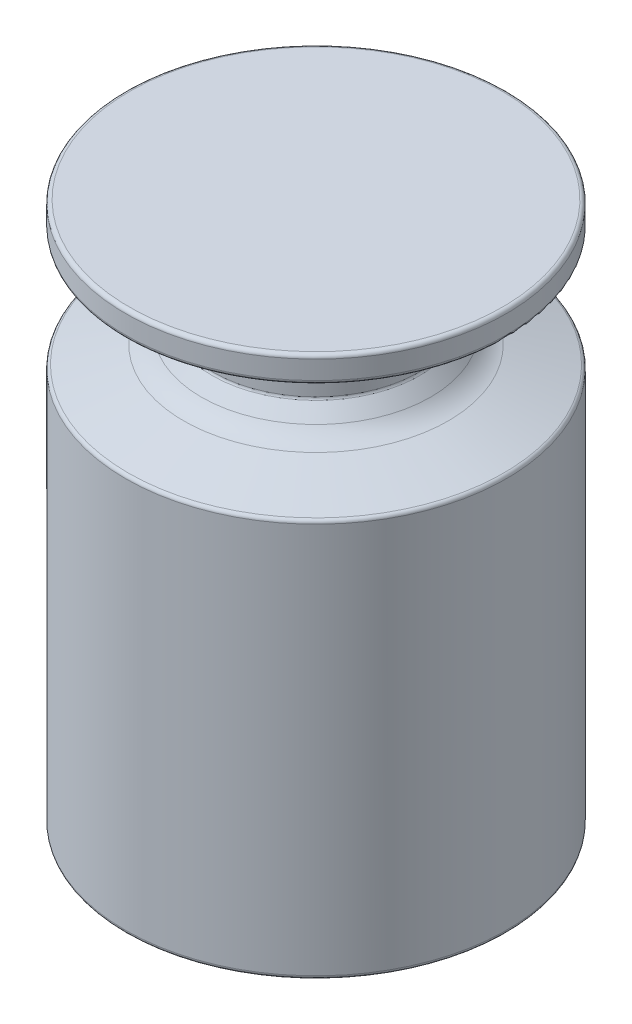
ISO-10303-21;
HEADER;
FILE_DESCRIPTION(('STEP AP214'),'2;1');
FILE_NAME('part.step','',(''),(''),'','','');
FILE_SCHEMA(('AUTOMOTIVE_DESIGN { 1 0 10303 214 1 1 1 1 }'));
ENDSEC;
DATA;
#1=APPLICATION_CONTEXT('core data for automotive mechanical design processes');
#2=APPLICATION_PROTOCOL_DEFINITION('international standard','automotive_design',2000,#1);
#3=PRODUCT_CONTEXT('',#1,'mechanical');
#4=PRODUCT('Part','Part','',(#3));
#5=PRODUCT_RELATED_PRODUCT_CATEGORY('part','',(#4));
#6=PRODUCT_DEFINITION_FORMATION('','',#4);
#7=PRODUCT_DEFINITION_CONTEXT('part definition',#1,'design');
#8=PRODUCT_DEFINITION('design','',#6,#7);
#9=PRODUCT_DEFINITION_SHAPE('','',#8);
#10=(LENGTH_UNIT() NAMED_UNIT(*) SI_UNIT(.MILLI.,.METRE.));
#11=(NAMED_UNIT(*) PLANE_ANGLE_UNIT() SI_UNIT($,.RADIAN.));
#12=(NAMED_UNIT(*) SI_UNIT($,.STERADIAN.) SOLID_ANGLE_UNIT());
#13=UNCERTAINTY_MEASURE_WITH_UNIT(LENGTH_MEASURE(1.E-05),#10,'distance_accuracy_value','');
#14=(GEOMETRIC_REPRESENTATION_CONTEXT(3) GLOBAL_UNCERTAINTY_ASSIGNED_CONTEXT((#13)) GLOBAL_UNIT_ASSIGNED_CONTEXT((#10,
#11,#12)) REPRESENTATION_CONTEXT('',''));
#15=CARTESIAN_POINT('',(0.,0.,0.));
#16=DIRECTION('',(0.,0.,1.));
#17=DIRECTION('',(1.,0.,0.));
#18=AXIS2_PLACEMENT_3D('',#15,#16,#17);
#19=CARTESIAN_POINT('',(25.,-35.55,0.));
#20=DIRECTION('',(0.,1.,0.));
#21=DIRECTION('',(0.,0.,1.));
#22=AXIS2_PLACEMENT_3D('',#19,#20,#21);
#23=PLANE('',#22);
#24=CARTESIAN_POINT('',(0.,-35.55,0.));
#25=DIRECTION('',(0.,1.,0.));
#26=DIRECTION('',(0.,0.,1.));
#27=AXIS2_PLACEMENT_3D('',#24,#25,#26);
#28=CIRCLE('',#27,24.5);
#29=CARTESIAN_POINT('',(0.,-35.55,24.5));
#30=VERTEX_POINT('',#29);
#31=EDGE_CURVE('E65',#30,#30,#28,.F.);
#32=ORIENTED_EDGE('',*,*,#31,.T.);
#33=EDGE_LOOP('',(#32));
#34=FACE_BOUND('',#33,.T.);
#35=ADVANCED_FACE('F30',(#34),#23,.F.);
#36=CARTESIAN_POINT('',(0.,67.0922710975279,0.));
#37=DIRECTION('',(0.,1.,0.));
#38=DIRECTION('',(0.,0.,1.));
#39=AXIS2_PLACEMENT_3D('',#36,#37,#38);
#40=CYLINDRICAL_SURFACE('',#39,25.);
#41=CARTESIAN_POINT('',(0.,-35.05,0.));
#42=DIRECTION('',(0.,1.,0.));
#43=DIRECTION('',(0.,0.,1.));
#44=AXIS2_PLACEMENT_3D('',#41,#42,#43);
#45=CIRCLE('',#44,25.);
#46=CARTESIAN_POINT('',(0.,-35.05,25.));
#47=VERTEX_POINT('',#46);
#48=EDGE_CURVE('E68',#47,#47,#45,.T.);
#49=ORIENTED_EDGE('',*,*,#48,.T.);
#50=EDGE_LOOP('',(#49));
#51=FACE_BOUND('',#50,.T.);
#52=CARTESIAN_POINT('',(0.,16.2833848318691,0.));
#53=DIRECTION('',(0.,-1.,0.));
#54=DIRECTION('',(0.,0.,-1.));
#55=AXIS2_PLACEMENT_3D('',#52,#53,#54);
#56=CIRCLE('',#55,25.);
#57=CARTESIAN_POINT('',(0.,16.2833848318691,-25.));
#58=VERTEX_POINT('',#57);
#59=EDGE_CURVE('E71',#58,#58,#56,.T.);
#60=ORIENTED_EDGE('',*,*,#59,.T.);
#61=EDGE_LOOP('',(#60));
#62=FACE_BOUND('',#61,.T.);
#63=ADVANCED_FACE('F108',(#51,#62),#40,.T.);
#64=CARTESIAN_POINT('',(0.,16.65,0.));
#65=DIRECTION('',(0.,-1.,0.));
#66=DIRECTION('',(0.,0.,-1.));
#67=AXIS2_PLACEMENT_3D('',#64,#65,#66);
#68=CONICAL_SURFACE('',#67,25.,1.2653637076959);
#69=CARTESIAN_POINT('',(0.,16.7602433072432,0.));
#70=DIRECTION('',(0.,1.,0.));
#71=DIRECTION('',(0.,0.,1.));
#72=AXIS2_PLACEMENT_3D('',#69,#70,#71);
#73=CIRCLE('',#72,24.6503528997521);
#74=CARTESIAN_POINT('',(0.,16.7602433072432,24.6503528997521));
#75=VERTEX_POINT('',#74);
#76=EDGE_CURVE('E62',#75,#75,#73,.T.);
#77=ORIENTED_EDGE('',*,*,#76,.T.);
#78=EDGE_LOOP('',(#77));
#79=FACE_BOUND('',#78,.T.);
#80=CARTESIAN_POINT('',(0.,19.0517586176472,0.));
#81=DIRECTION('',(0.,-1.,0.));
#82=DIRECTION('',(0.,0.,-1.));
#83=AXIS2_PLACEMENT_3D('',#80,#81,#82);
#84=CIRCLE('',#83,17.382594851739);
#85=CARTESIAN_POINT('',(0.,19.0517586176472,-17.382594851739));
#86=VERTEX_POINT('',#85);
#87=EDGE_CURVE('E74',#86,#86,#84,.T.);
#88=ORIENTED_EDGE('',*,*,#87,.T.);
#89=EDGE_LOOP('',(#88));
#90=FACE_BOUND('',#89,.T.);
#91=ADVANCED_FACE('F113',(#79,#90),#68,.T.);
#92=CARTESIAN_POINT('',(0.,19.4876890999108,0.));
#93=DIRECTION('',(0.,-1.,0.));
#94=DIRECTION('',(0.,0.,-1.));
#95=AXIS2_PLACEMENT_3D('',#92,#93,#94);
#96=CONICAL_SURFACE('',#95,16.,0.700962888192259);
#97=CARTESIAN_POINT('',(0.,22.3103101696415,0.));
#98=DIRECTION('',(0.,-1.,0.));
#99=DIRECTION('',(0.,0.,-1.));
#100=AXIS2_PLACEMENT_3D('',#97,#98,#99);
#101=CIRCLE('',#100,13.6178892383935);
#102=CARTESIAN_POINT('',(0.,22.3103101696415,-13.6178892383935));
#103=VERTEX_POINT('',#102);
#104=EDGE_CURVE('E10',#103,#103,#101,.T.);
#105=ORIENTED_EDGE('',*,*,#104,.T.);
#106=EDGE_LOOP('',(#105));
#107=FACE_BOUND('',#106,.T.);
#108=CARTESIAN_POINT('',(0.,20.5955741414353,0.));
#109=DIRECTION('',(0.,-1.,0.));
#110=DIRECTION('',(0.,0.,-1.));
#111=AXIS2_PLACEMENT_3D('',#108,#109,#110);
#112=CIRCLE('',#111,15.0650162331955);
#113=CARTESIAN_POINT('',(0.,20.5955741414353,-15.0650162331955));
#114=VERTEX_POINT('',#113);
#115=EDGE_CURVE('E77',#114,#114,#112,.F.);
#116=ORIENTED_EDGE('',*,*,#115,.T.);
#117=EDGE_LOOP('',(#116));
#118=FACE_BOUND('',#117,.T.);
#119=ADVANCED_FACE('F119',(#107,#118),#96,.T.);
#120=CARTESIAN_POINT('',(0.,67.0922710975279,0.));
#121=DIRECTION('',(0.,1.,0.));
#122=DIRECTION('',(0.,0.,1.));
#123=AXIS2_PLACEMENT_3D('',#120,#121,#122);
#124=CYLINDRICAL_SURFACE('',#123,13.5);
#125=CARTESIAN_POINT('',(0.,26.2672129073632,0.));
#126=DIRECTION('',(0.,1.,0.));
#127=DIRECTION('',(0.,0.,1.));
#128=AXIS2_PLACEMENT_3D('',#125,#126,#127);
#129=CIRCLE('',#128,13.5);
#130=CARTESIAN_POINT('',(0.,26.2672129073632,13.5));
#131=VERTEX_POINT('',#130);
#132=EDGE_CURVE('E37',#131,#131,#129,.F.);
#133=ORIENTED_EDGE('',*,*,#132,.T.);
#134=EDGE_LOOP('',(#133));
#135=FACE_BOUND('',#134,.T.);
#136=CARTESIAN_POINT('',(0.,22.6327870926368,0.));
#137=DIRECTION('',(0.,1.,0.));
#138=DIRECTION('',(0.,0.,1.));
#139=AXIS2_PLACEMENT_3D('',#136,#137,#138);
#140=CIRCLE('',#139,13.5);
#141=CARTESIAN_POINT('',(0.,22.6327870926368,13.5));
#142=VERTEX_POINT('',#141);
#143=EDGE_CURVE('E41',#142,#142,#140,.T.);
#144=ORIENTED_EDGE('',*,*,#143,.T.);
#145=EDGE_LOOP('',(#144));
#146=FACE_BOUND('',#145,.T.);
#147=ADVANCED_FACE('F123',(#135,#146),#124,.T.);
#148=CARTESIAN_POINT('',(0.,26.45,0.));
#149=DIRECTION('',(0.,1.,0.));
#150=DIRECTION('',(0.,0.,1.));
#151=AXIS2_PLACEMENT_3D('',#148,#149,#150);
#152=CONICAL_SURFACE('',#151,13.5,0.700962888192265);
#153=CARTESIAN_POINT('',(0.,26.5896898303585,0.));
#154=DIRECTION('',(0.,1.,0.));
#155=DIRECTION('',(0.,0.,1.));
#156=AXIS2_PLACEMENT_3D('',#153,#154,#155);
#157=CIRCLE('',#156,13.6178892383935);
#158=CARTESIAN_POINT('',(0.,26.5896898303585,13.6178892383935));
#159=VERTEX_POINT('',#158);
#160=EDGE_CURVE('E45',#159,#159,#157,.T.);
#161=ORIENTED_EDGE('',*,*,#160,.T.);
#162=EDGE_LOOP('',(#161));
#163=FACE_BOUND('',#162,.T.);
#164=CARTESIAN_POINT('',(0.,28.3044258585647,0.));
#165=DIRECTION('',(0.,1.,0.));
#166=DIRECTION('',(0.,0.,1.));
#167=AXIS2_PLACEMENT_3D('',#164,#165,#166);
#168=CIRCLE('',#167,15.0650162331955);
#169=CARTESIAN_POINT('',(0.,28.3044258585647,15.0650162331955));
#170=VERTEX_POINT('',#169);
#171=EDGE_CURVE('E80',#170,#170,#168,.F.);
#172=ORIENTED_EDGE('',*,*,#171,.T.);
#173=EDGE_LOOP('',(#172));
#174=FACE_BOUND('',#173,.T.);
#175=ADVANCED_FACE('F126',(#163,#174),#152,.T.);
#176=CARTESIAN_POINT('',(0.,29.4123109000892,0.));
#177=DIRECTION('',(0.,1.,0.));
#178=DIRECTION('',(0.,0.,1.));
#179=AXIS2_PLACEMENT_3D('',#176,#177,#178);
#180=CONICAL_SURFACE('',#179,16.,1.2653637076959);
#181=CARTESIAN_POINT('',(0.,32.1397566927568,0.));
#182=DIRECTION('',(0.,-1.,0.));
#183=DIRECTION('',(0.,0.,-1.));
#184=AXIS2_PLACEMENT_3D('',#181,#182,#183);
#185=CIRCLE('',#184,24.6503528997521);
#186=CARTESIAN_POINT('',(0.,32.1397566927568,-24.6503528997521));
#187=VERTEX_POINT('',#186);
#188=EDGE_CURVE('E53',#187,#187,#185,.T.);
#189=ORIENTED_EDGE('',*,*,#188,.T.);
#190=EDGE_LOOP('',(#189));
#191=FACE_BOUND('',#190,.T.);
#192=CARTESIAN_POINT('',(0.,29.8482413823528,0.));
#193=DIRECTION('',(0.,1.,0.));
#194=DIRECTION('',(0.,0.,1.));
#195=AXIS2_PLACEMENT_3D('',#192,#193,#194);
#196=CIRCLE('',#195,17.382594851739);
#197=CARTESIAN_POINT('',(0.,29.8482413823528,17.382594851739));
#198=VERTEX_POINT('',#197);
#199=EDGE_CURVE('E83',#198,#198,#196,.T.);
#200=ORIENTED_EDGE('',*,*,#199,.T.);
#201=EDGE_LOOP('',(#200));
#202=FACE_BOUND('',#201,.T.);
#203=ADVANCED_FACE('F87',(#191,#202),#180,.T.);
#204=CARTESIAN_POINT('',(0.,67.0922710975279,0.));
#205=DIRECTION('',(0.,1.,0.));
#206=DIRECTION('',(0.,0.,1.));
#207=AXIS2_PLACEMENT_3D('',#204,#205,#206);
#208=CYLINDRICAL_SURFACE('',#207,25.);
#209=CARTESIAN_POINT('',(0.,32.6166151681309,0.));
#210=DIRECTION('',(0.,-1.,0.));
#211=DIRECTION('',(0.,0.,-1.));
#212=AXIS2_PLACEMENT_3D('',#209,#210,#211);
#213=CIRCLE('',#212,25.);
#214=CARTESIAN_POINT('',(0.,32.6166151681309,-25.));
#215=VERTEX_POINT('',#214);
#216=EDGE_CURVE('E56',#215,#215,#213,.F.);
#217=ORIENTED_EDGE('',*,*,#216,.T.);
#218=EDGE_LOOP('',(#217));
#219=FACE_BOUND('',#218,.T.);
#220=CARTESIAN_POINT('',(0.,35.05,0.));
#221=DIRECTION('',(0.,-1.,0.));
#222=DIRECTION('',(0.,0.,-1.));
#223=AXIS2_PLACEMENT_3D('',#220,#221,#222);
#224=CIRCLE('',#223,25.);
#225=CARTESIAN_POINT('',(0.,35.05,-25.));
#226=VERTEX_POINT('',#225);
#227=EDGE_CURVE('E59',#226,#226,#224,.T.);
#228=ORIENTED_EDGE('',*,*,#227,.T.);
#229=EDGE_LOOP('',(#228));
#230=FACE_BOUND('',#229,.T.);
#231=ADVANCED_FACE('F102',(#219,#230),#208,.T.);
#232=CARTESIAN_POINT('',(0.,35.55,0.));
#233=DIRECTION('',(0.,-1.,0.));
#234=DIRECTION('',(0.,0.,-1.));
#235=AXIS2_PLACEMENT_3D('',#232,#233,#234);
#236=PLANE('',#235);
#237=CARTESIAN_POINT('',(0.,35.55,0.));
#238=DIRECTION('',(0.,-1.,0.));
#239=DIRECTION('',(0.,0.,-1.));
#240=AXIS2_PLACEMENT_3D('',#237,#238,#239);
#241=CIRCLE('',#240,24.5);
#242=CARTESIAN_POINT('',(0.,35.55,-24.5));
#243=VERTEX_POINT('',#242);
#244=EDGE_CURVE('E50',#243,#243,#241,.F.);
#245=ORIENTED_EDGE('',*,*,#244,.T.);
#246=EDGE_LOOP('',(#245));
#247=FACE_BOUND('',#246,.T.);
#248=ADVANCED_FACE('F92',(#247),#236,.F.);
#249=CARTESIAN_POINT('',(0.,25.0796566286117,0.));
#250=DIRECTION('',(0.,1.,0.));
#251=DIRECTION('',(0.,0.,1.));
#252=AXIS2_PLACEMENT_3D('',#249,#250,#251);
#253=TOROIDAL_SURFACE('',#252,18.8861238492603,5.);
#254=ORIENTED_EDGE('',*,*,#171,.F.);
#255=EDGE_LOOP('',(#254));
#256=FACE_BOUND('',#255,.T.);
#257=ORIENTED_EDGE('',*,*,#199,.F.);
#258=EDGE_LOOP('',(#257));
#259=FACE_BOUND('',#258,.T.);
#260=ADVANCED_FACE('F89',(#256,#259),#253,.F.);
#261=CARTESIAN_POINT('',(0.,23.8203433713883,0.));
#262=DIRECTION('',(0.,1.,0.));
#263=DIRECTION('',(0.,0.,1.));
#264=AXIS2_PLACEMENT_3D('',#261,#262,#263);
#265=TOROIDAL_SURFACE('',#264,18.8861238492603,5.);
#266=ORIENTED_EDGE('',*,*,#87,.F.);
#267=EDGE_LOOP('',(#266));
#268=FACE_BOUND('',#267,.T.);
#269=ORIENTED_EDGE('',*,*,#115,.F.);
#270=EDGE_LOOP('',(#269));
#271=FACE_BOUND('',#270,.T.);
#272=ADVANCED_FACE('F91',(#268,#271),#265,.F.);
#273=CARTESIAN_POINT('',(0.,-35.05,0.));
#274=DIRECTION('',(0.,1.,0.));
#275=DIRECTION('',(0.,0.,1.));
#276=AXIS2_PLACEMENT_3D('',#273,#274,#275);
#277=TOROIDAL_SURFACE('',#276,24.5,0.5);
#278=ORIENTED_EDGE('',*,*,#31,.F.);
#279=EDGE_LOOP('',(#278));
#280=FACE_BOUND('',#279,.T.);
#281=ORIENTED_EDGE('',*,*,#48,.F.);
#282=EDGE_LOOP('',(#281));
#283=FACE_BOUND('',#282,.T.);
#284=ADVANCED_FACE('F99',(#280,#283),#277,.T.);
#285=CARTESIAN_POINT('',(0.,16.2833848318691,0.));
#286=DIRECTION('',(0.,-1.,0.));
#287=DIRECTION('',(0.,0.,-1.));
#288=AXIS2_PLACEMENT_3D('',#285,#286,#287);
#289=TOROIDAL_SURFACE('',#288,24.5,0.5);
#290=ORIENTED_EDGE('',*,*,#59,.F.);
#291=EDGE_LOOP('',(#290));
#292=FACE_BOUND('',#291,.T.);
#293=ORIENTED_EDGE('',*,*,#76,.F.);
#294=EDGE_LOOP('',(#293));
#295=FACE_BOUND('',#294,.T.);
#296=ADVANCED_FACE('F153',(#292,#295),#289,.T.);
#297=CARTESIAN_POINT('',(0.,32.6166151681309,0.));
#298=DIRECTION('',(0.,-1.,0.));
#299=DIRECTION('',(0.,0.,-1.));
#300=AXIS2_PLACEMENT_3D('',#297,#298,#299);
#301=TOROIDAL_SURFACE('',#300,24.5,0.5);
#302=ORIENTED_EDGE('',*,*,#188,.F.);
#303=EDGE_LOOP('',(#302));
#304=FACE_BOUND('',#303,.T.);
#305=ORIENTED_EDGE('',*,*,#216,.F.);
#306=EDGE_LOOP('',(#305));
#307=FACE_BOUND('',#306,.T.);
#308=ADVANCED_FACE('F145',(#304,#307),#301,.T.);
#309=CARTESIAN_POINT('',(0.,35.05,0.));
#310=DIRECTION('',(0.,-1.,0.));
#311=DIRECTION('',(0.,0.,-1.));
#312=AXIS2_PLACEMENT_3D('',#309,#310,#311);
#313=TOROIDAL_SURFACE('',#312,24.5,0.5);
#314=ORIENTED_EDGE('',*,*,#227,.F.);
#315=EDGE_LOOP('',(#314));
#316=FACE_BOUND('',#315,.T.);
#317=ORIENTED_EDGE('',*,*,#244,.F.);
#318=EDGE_LOOP('',(#317));
#319=FACE_BOUND('',#318,.T.);
#320=ADVANCED_FACE('F141',(#316,#319),#313,.T.);
#321=CARTESIAN_POINT('',(0.,26.2672129073632,0.));
#322=DIRECTION('',(0.,1.,0.));
#323=DIRECTION('',(0.,0.,1.));
#324=AXIS2_PLACEMENT_3D('',#321,#322,#323);
#325=TOROIDAL_SURFACE('',#324,14.,0.5);
#326=ORIENTED_EDGE('',*,*,#132,.F.);
#327=EDGE_LOOP('',(#326));
#328=FACE_BOUND('',#327,.T.);
#329=ORIENTED_EDGE('',*,*,#160,.F.);
#330=EDGE_LOOP('',(#329));
#331=FACE_BOUND('',#330,.T.);
#332=ADVANCED_FACE('F144',(#328,#331),#325,.F.);
#333=CARTESIAN_POINT('',(0.,22.6327870926368,0.));
#334=DIRECTION('',(0.,1.,0.));
#335=DIRECTION('',(0.,0.,1.));
#336=AXIS2_PLACEMENT_3D('',#333,#334,#335);
#337=TOROIDAL_SURFACE('',#336,14.,0.5);
#338=ORIENTED_EDGE('',*,*,#104,.F.);
#339=EDGE_LOOP('',(#338));
#340=FACE_BOUND('',#339,.T.);
#341=ORIENTED_EDGE('',*,*,#143,.F.);
#342=EDGE_LOOP('',(#341));
#343=FACE_BOUND('',#342,.T.);
#344=ADVANCED_FACE('F32',(#340,#343),#337,.F.);
#345=CLOSED_SHELL('',(#35,#63,#91,#119,#147,#175,#203,#231,#248,#260,#272,#284,#296,#308,#320,
#332,#344));
#346=MANIFOLD_SOLID_BREP('B2',#345);
#347=ADVANCED_BREP_SHAPE_REPRESENTATION('',(#18,#346),#14);
#348=SHAPE_DEFINITION_REPRESENTATION(#9,#347);
ENDSEC;
END-ISO-10303-21;
